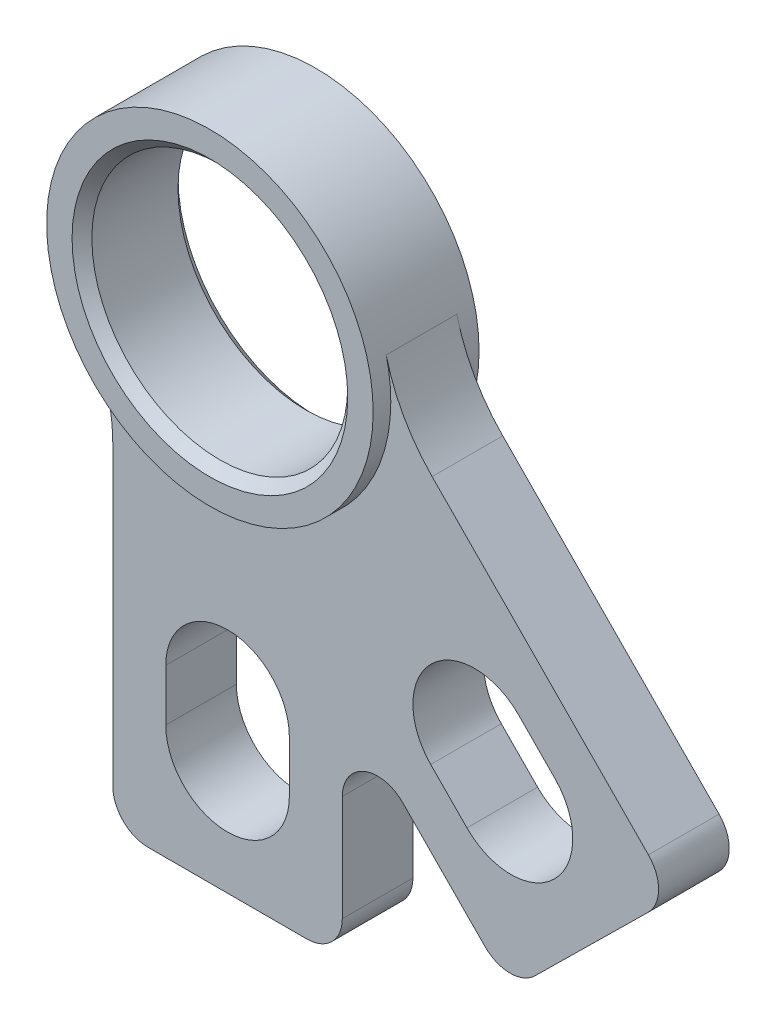
ISO-10303-21;
HEADER;
FILE_DESCRIPTION(('STEP AP214'),'2;1');
FILE_NAME('part.step','',(''),(''),'','','');
FILE_SCHEMA(('AUTOMOTIVE_DESIGN { 1 0 10303 214 1 1 1 1 }'));
ENDSEC;
DATA;
#1=APPLICATION_CONTEXT('core data for automotive mechanical design processes');
#2=APPLICATION_PROTOCOL_DEFINITION('international standard','automotive_design',2000,#1);
#3=PRODUCT_CONTEXT('',#1,'mechanical');
#4=PRODUCT('Part','Part','',(#3));
#5=PRODUCT_RELATED_PRODUCT_CATEGORY('part','',(#4));
#6=PRODUCT_DEFINITION_FORMATION('','',#4);
#7=PRODUCT_DEFINITION_CONTEXT('part definition',#1,'design');
#8=PRODUCT_DEFINITION('design','',#6,#7);
#9=PRODUCT_DEFINITION_SHAPE('','',#8);
#10=(LENGTH_UNIT() NAMED_UNIT(*) SI_UNIT(.MILLI.,.METRE.));
#11=(NAMED_UNIT(*) PLANE_ANGLE_UNIT() SI_UNIT($,.RADIAN.));
#12=(NAMED_UNIT(*) SI_UNIT($,.STERADIAN.) SOLID_ANGLE_UNIT());
#13=UNCERTAINTY_MEASURE_WITH_UNIT(LENGTH_MEASURE(1.E-05),#10,'distance_accuracy_value','');
#14=(GEOMETRIC_REPRESENTATION_CONTEXT(3) GLOBAL_UNCERTAINTY_ASSIGNED_CONTEXT((#13)) GLOBAL_UNIT_ASSIGNED_CONTEXT((#10,
#11,#12)) REPRESENTATION_CONTEXT('',''));
#15=CARTESIAN_POINT('',(0.,0.,0.));
#16=DIRECTION('',(0.,0.,1.));
#17=DIRECTION('',(1.,0.,0.));
#18=AXIS2_PLACEMENT_3D('',#15,#16,#17);
#19=CARTESIAN_POINT('',(0.,0.,4.7625));
#20=DIRECTION('',(0.,0.,-1.));
#21=DIRECTION('',(-1.,0.,0.));
#22=AXIS2_PLACEMENT_3D('',#19,#20,#21);
#23=CYLINDRICAL_SURFACE('',#22,11.5062);
#24=CARTESIAN_POINT('',(0.,0.,-3.87350000000004));
#25=DIRECTION('',(0.,0.,1.));
#26=DIRECTION('',(1.,0.,0.));
#27=AXIS2_PLACEMENT_3D('',#24,#25,#26);
#28=CIRCLE('',#27,11.5062);
#29=CARTESIAN_POINT('',(-11.5062,0.,-3.87350000000004));
#30=VERTEX_POINT('',#29);
#31=EDGE_CURVE('E50',#30,#30,#28,.F.);
#32=CARTESIAN_POINT('',(0.,0.,3.87349999999996));
#33=DIRECTION('',(0.,0.,1.));
#34=DIRECTION('',(1.,0.,0.));
#35=AXIS2_PLACEMENT_3D('',#32,#33,#34);
#36=CIRCLE('',#35,11.5062);
#37=CARTESIAN_POINT('',(-11.5062,0.,3.87349999999996));
#38=VERTEX_POINT('',#37);
#39=EDGE_CURVE('E481',#38,#38,#36,.T.);
#40=CARTESIAN_POINT('',(-11.5062,0.,-3.87350000000004));
#41=CARTESIAN_POINT('',(-11.5062,0.,-3.79280208333337));
#42=CARTESIAN_POINT('',(-11.5062,0.,-3.7121041666667));
#43=CARTESIAN_POINT('',(-11.5062,0.,-3.55070833333337));
#44=CARTESIAN_POINT('',(-11.5062,0.,-3.4700104166667));
#45=CARTESIAN_POINT('',(-11.5062,0.,-3.30861458333337));
#46=CARTESIAN_POINT('',(-11.5062,0.,-3.2279166666667));
#47=CARTESIAN_POINT('',(-11.5062,0.,-3.06652083333337));
#48=CARTESIAN_POINT('',(-11.5062,0.,-2.9858229166667));
#49=CARTESIAN_POINT('',(-11.5062,0.,-2.82442708333337));
#50=CARTESIAN_POINT('',(-11.5062,0.,-2.7437291666667));
#51=CARTESIAN_POINT('',(-11.5062,0.,-2.58233333333337));
#52=CARTESIAN_POINT('',(-11.5062,0.,-2.5016354166667));
#53=CARTESIAN_POINT('',(-11.5062,0.,-2.34023958333337));
#54=CARTESIAN_POINT('',(-11.5062,0.,-2.2595416666667));
#55=CARTESIAN_POINT('',(-11.5062,0.,-2.09814583333337));
#56=CARTESIAN_POINT('',(-11.5062,0.,-2.0174479166667));
#57=CARTESIAN_POINT('',(-11.5062,0.,-1.85605208333337));
#58=CARTESIAN_POINT('',(-11.5062,0.,-1.7753541666667));
#59=CARTESIAN_POINT('',(-11.5062,0.,-1.61395833333337));
#60=CARTESIAN_POINT('',(-11.5062,0.,-1.5332604166667));
#61=CARTESIAN_POINT('',(-11.5062,0.,-1.37186458333337));
#62=CARTESIAN_POINT('',(-11.5062,0.,-1.2911666666667));
#63=CARTESIAN_POINT('',(-11.5062,0.,-1.12977083333337));
#64=CARTESIAN_POINT('',(-11.5062,0.,-1.0490729166667));
#65=CARTESIAN_POINT('',(-11.5062,0.,-0.887677083333371));
#66=CARTESIAN_POINT('',(-11.5062,0.,-0.806979166666704));
#67=CARTESIAN_POINT('',(-11.5062,0.,-0.645583333333371));
#68=CARTESIAN_POINT('',(-11.5062,0.,-0.564885416666704));
#69=CARTESIAN_POINT('',(-11.5062,0.,-0.403489583333371));
#70=CARTESIAN_POINT('',(-11.5062,0.,-0.322791666666704));
#71=CARTESIAN_POINT('',(-11.5062,0.,-0.161395833333371));
#72=CARTESIAN_POINT('',(-11.5062,0.,-0.080697916666704));
#73=CARTESIAN_POINT('',(-11.5062,0.,0.0806979166666294));
#74=CARTESIAN_POINT('',(-11.5062,0.,0.161395833333296));
#75=CARTESIAN_POINT('',(-11.5062,0.,0.32279166666663));
#76=CARTESIAN_POINT('',(-11.5062,0.,0.403489583333296));
#77=CARTESIAN_POINT('',(-11.5062,0.,0.56488541666663));
#78=CARTESIAN_POINT('',(-11.5062,0.,0.645583333333296));
#79=CARTESIAN_POINT('',(-11.5062,0.,0.80697916666663));
#80=CARTESIAN_POINT('',(-11.5062,0.,0.887677083333296));
#81=CARTESIAN_POINT('',(-11.5062,0.,1.04907291666663));
#82=CARTESIAN_POINT('',(-11.5062,0.,1.1297708333333));
#83=CARTESIAN_POINT('',(-11.5062,0.,1.29116666666663));
#84=CARTESIAN_POINT('',(-11.5062,0.,1.3718645833333));
#85=CARTESIAN_POINT('',(-11.5062,0.,1.53326041666663));
#86=CARTESIAN_POINT('',(-11.5062,0.,1.6139583333333));
#87=CARTESIAN_POINT('',(-11.5062,0.,1.77535416666663));
#88=CARTESIAN_POINT('',(-11.5062,0.,1.8560520833333));
#89=CARTESIAN_POINT('',(-11.5062,0.,2.01744791666663));
#90=CARTESIAN_POINT('',(-11.5062,0.,2.0981458333333));
#91=CARTESIAN_POINT('',(-11.5062,0.,2.25954166666663));
#92=CARTESIAN_POINT('',(-11.5062,0.,2.3402395833333));
#93=CARTESIAN_POINT('',(-11.5062,0.,2.50163541666663));
#94=CARTESIAN_POINT('',(-11.5062,0.,2.5823333333333));
#95=CARTESIAN_POINT('',(-11.5062,0.,2.74372916666663));
#96=CARTESIAN_POINT('',(-11.5062,0.,2.8244270833333));
#97=CARTESIAN_POINT('',(-11.5062,0.,2.98582291666663));
#98=CARTESIAN_POINT('',(-11.5062,0.,3.0665208333333));
#99=CARTESIAN_POINT('',(-11.5062,0.,3.22791666666663));
#100=CARTESIAN_POINT('',(-11.5062,0.,3.3086145833333));
#101=CARTESIAN_POINT('',(-11.5062,0.,3.47001041666663));
#102=CARTESIAN_POINT('',(-11.5062,0.,3.5507083333333));
#103=CARTESIAN_POINT('',(-11.5062,0.,3.71210416666663));
#104=CARTESIAN_POINT('',(-11.5062,0.,3.7928020833333));
#105=CARTESIAN_POINT('',(-11.5062,0.,3.87349999999996));
#106=B_SPLINE_CURVE_WITH_KNOTS('',3,(#40,#41,#42,#43,#44,#45,#46,#47,#48,#49,#50,#51,#52,#53,
#54,#55,#56,#57,#58,#59,#60,#61,#62,#63,#64,#65,#66,#67,#68,#69,#70,#71,#72,#73,#74,#75,#76,#77,
#78,#79,#80,#81,#82,#83,#84,#85,#86,#87,#88,#89,#90,#91,#92,#93,#94,#95,#96,#97,#98,#99,#100,
#101,#102,#103,#104,#105),.UNSPECIFIED.,.F.,.F.,(4,2,2,2,2,2,2,2,2,2,2,2,2,2,2,2,2,2,2,2,2,2,2,
2,2,2,2,2,2,2,2,2,4),(0.,0.24209375,0.4841875,0.72628125,0.968375,1.21046875,1.4525625,
1.69465625,1.93675,2.17884375,2.4209375,2.66303125,2.905125,3.14721875,3.3893125,3.63140625,
3.8735,4.11559375,4.3576875,4.59978125,4.841875,5.08396875,5.3260625,5.56815625,5.81025,
6.05234375,6.2944375,6.53653125,6.778625,7.02071875,7.2628125,7.50490625,7.747),.UNSPECIFIED.);
#107=EDGE_CURVE('BSEAM41',#30,#38,#106,.T.);
#108=ORIENTED_EDGE('',*,*,#31,.T.);
#109=ORIENTED_EDGE('',*,*,#39,.T.);
#110=ORIENTED_EDGE('',*,*,#107,.T.);
#111=ORIENTED_EDGE('',*,*,#107,.F.);
#112=EDGE_LOOP('',(#108,#110,#109,#111));
#113=FACE_BOUND('',#112,.T.);
#114=ADVANCED_FACE('F41',(#113),#23,.F.);
#115=CARTESIAN_POINT('',(0.,0.,4.7625));
#116=DIRECTION('',(0.,0.,-1.));
#117=DIRECTION('',(-1.,0.,0.));
#118=AXIS2_PLACEMENT_3D('',#115,#116,#117);
#119=CYLINDRICAL_SURFACE('',#118,14.6812);
#120=DIRECTION('',(0.,0.,-1.));
#121=VECTOR('',#120,1.);
#122=CARTESIAN_POINT('',(-12.5851932668321,-7.55979787272683,3.175));
#123=LINE('',#122,#121);
#124=CARTESIAN_POINT('',(-12.5851932668321,-7.55979787272682,3.175));
#125=VERTEX_POINT('',#124);
#126=CARTESIAN_POINT('',(-12.5851932668321,-7.55979787272683,-3.175));
#127=VERTEX_POINT('',#126);
#128=EDGE_CURVE('E244',#125,#127,#123,.T.);
#129=ORIENTED_EDGE('',*,*,#128,.F.);
#130=CARTESIAN_POINT('',(0.,0.,3.175));
#131=DIRECTION('',(0.,0.,1.));
#132=DIRECTION('',(1.,0.,0.));
#133=AXIS2_PLACEMENT_3D('',#130,#131,#132);
#134=CIRCLE('',#133,14.6812);
#135=CARTESIAN_POINT('',(14.2696280521156,3.45186162733583,3.175));
#136=VERTEX_POINT('',#135);
#137=EDGE_CURVE('E261',#125,#136,#134,.T.);
#138=ORIENTED_EDGE('',*,*,#137,.T.);
#139=DIRECTION('',(0.,0.,-1.));
#140=VECTOR('',#139,1.);
#141=CARTESIAN_POINT('',(14.2696280521157,3.45186162733581,3.175));
#142=LINE('',#141,#140);
#143=CARTESIAN_POINT('',(14.2696280521157,3.45186162733581,-3.175));
#144=VERTEX_POINT('',#143);
#145=EDGE_CURVE('E317',#136,#144,#142,.T.);
#146=ORIENTED_EDGE('',*,*,#145,.T.);
#147=CARTESIAN_POINT('',(0.,0.,-3.175));
#148=DIRECTION('',(0.,0.,1.));
#149=DIRECTION('',(1.,0.,0.));
#150=AXIS2_PLACEMENT_3D('',#147,#148,#149);
#151=CIRCLE('',#150,14.6812);
#152=EDGE_CURVE('E318',#127,#144,#151,.T.);
#153=ORIENTED_EDGE('',*,*,#152,.F.);
#154=EDGE_LOOP('',(#129,#138,#146,#153));
#155=FACE_BOUND('',#154,.T.);
#156=CARTESIAN_POINT('',(0.,0.,4.7625));
#157=DIRECTION('',(0.,0.,1.));
#158=DIRECTION('',(1.,0.,0.));
#159=AXIS2_PLACEMENT_3D('',#156,#157,#158);
#160=CIRCLE('',#159,14.6812);
#161=CARTESIAN_POINT('',(14.6812,0.,4.7625));
#162=VERTEX_POINT('',#161);
#163=EDGE_CURVE('E408',#162,#162,#160,.T.);
#164=ORIENTED_EDGE('',*,*,#163,.F.);
#165=EDGE_LOOP('',(#164));
#166=FACE_BOUND('',#165,.T.);
#167=CARTESIAN_POINT('',(0.,0.,-4.7625));
#168=DIRECTION('',(0.,0.,1.));
#169=DIRECTION('',(1.,0.,0.));
#170=AXIS2_PLACEMENT_3D('',#167,#168,#169);
#171=CIRCLE('',#170,14.6812);
#172=CARTESIAN_POINT('',(14.6812,0.,-4.7625));
#173=VERTEX_POINT('',#172);
#174=EDGE_CURVE('E392',#173,#173,#171,.T.);
#175=ORIENTED_EDGE('',*,*,#174,.T.);
#176=EDGE_LOOP('',(#175));
#177=FACE_BOUND('',#176,.T.);
#178=ADVANCED_FACE('F503',(#155,#166,#177),#119,.T.);
#179=CARTESIAN_POINT('',(0.,0.,4.7625));
#180=DIRECTION('',(0.,0.,1.));
#181=DIRECTION('',(1.,0.,0.));
#182=AXIS2_PLACEMENT_3D('',#179,#180,#181);
#183=PLANE('',#182);
#184=CARTESIAN_POINT('',(0.,0.,4.7625));
#185=DIRECTION('',(0.,0.,1.));
#186=DIRECTION('',(1.,0.,0.));
#187=AXIS2_PLACEMENT_3D('',#184,#185,#186);
#188=CIRCLE('',#187,12.3952);
#189=CARTESIAN_POINT('',(12.3952,0.,4.7625));
#190=VERTEX_POINT('',#189);
#191=EDGE_CURVE('E11',#190,#190,#188,.F.);
#192=ORIENTED_EDGE('',*,*,#191,.T.);
#193=EDGE_LOOP('',(#192));
#194=FACE_BOUND('',#193,.T.);
#195=ORIENTED_EDGE('',*,*,#163,.T.);
#196=EDGE_LOOP('',(#195));
#197=FACE_BOUND('',#196,.T.);
#198=ADVANCED_FACE('F499',(#194,#197),#183,.T.);
#199=CARTESIAN_POINT('',(0.,0.,-4.7625));
#200=DIRECTION('',(0.,0.,1.));
#201=DIRECTION('',(1.,0.,0.));
#202=AXIS2_PLACEMENT_3D('',#199,#200,#201);
#203=PLANE('',#202);
#204=CARTESIAN_POINT('',(0.,0.,-4.7625));
#205=DIRECTION('',(0.,0.,1.));
#206=DIRECTION('',(1.,0.,0.));
#207=AXIS2_PLACEMENT_3D('',#204,#205,#206);
#208=CIRCLE('',#207,12.3952);
#209=CARTESIAN_POINT('',(12.3952,0.,-4.7625));
#210=VERTEX_POINT('',#209);
#211=EDGE_CURVE('E477',#210,#210,#208,.T.);
#212=ORIENTED_EDGE('',*,*,#211,.T.);
#213=EDGE_LOOP('',(#212));
#214=FACE_BOUND('',#213,.T.);
#215=ORIENTED_EDGE('',*,*,#174,.F.);
#216=EDGE_LOOP('',(#215));
#217=FACE_BOUND('',#216,.T.);
#218=ADVANCED_FACE('F495',(#214,#217),#203,.F.);
#219=CARTESIAN_POINT('',(0.,-30.6387499999984,3.175));
#220=DIRECTION('',(0.,0.,-1.));
#221=DIRECTION('',(-1.,0.,0.));
#222=AXIS2_PLACEMENT_3D('',#219,#220,#221);
#223=CYLINDRICAL_SURFACE('',#222,5.55624999999839);
#224=CARTESIAN_POINT('',(0.,-30.6387499999984,-3.175));
#225=DIRECTION('',(0.,0.,1.));
#226=DIRECTION('',(1.,0.,0.));
#227=AXIS2_PLACEMENT_3D('',#224,#225,#226);
#228=CIRCLE('',#227,5.55624999999839);
#229=CARTESIAN_POINT('',(5.55624999999834,-30.6387499999984,-3.175));
#230=VERTEX_POINT('',#229);
#231=CARTESIAN_POINT('',(-5.55624999999845,-30.6387499999984,-3.175));
#232=VERTEX_POINT('',#231);
#233=EDGE_CURVE('E364',#230,#232,#228,.T.);
#234=ORIENTED_EDGE('',*,*,#233,.F.);
#235=DIRECTION('',(0.,0.,-1.));
#236=VECTOR('',#235,1.);
#237=CARTESIAN_POINT('',(5.55624999999834,-30.6387499999984,3.175));
#238=LINE('',#237,#236);
#239=CARTESIAN_POINT('',(5.55624999999834,-30.6387499999984,3.175));
#240=VERTEX_POINT('',#239);
#241=EDGE_CURVE('E389',#240,#230,#238,.T.);
#242=ORIENTED_EDGE('',*,*,#241,.F.);
#243=CARTESIAN_POINT('',(0.,-30.6387499999984,3.175));
#244=DIRECTION('',(0.,0.,1.));
#245=DIRECTION('',(1.,0.,0.));
#246=AXIS2_PLACEMENT_3D('',#243,#244,#245);
#247=CIRCLE('',#246,5.55624999999839);
#248=CARTESIAN_POINT('',(-5.55624999999845,-30.6387499999984,3.175));
#249=VERTEX_POINT('',#248);
#250=EDGE_CURVE('E302',#240,#249,#247,.T.);
#251=ORIENTED_EDGE('',*,*,#250,.T.);
#252=DIRECTION('',(0.,0.,-1.));
#253=VECTOR('',#252,1.);
#254=CARTESIAN_POINT('',(-5.55624999999845,-30.6387499999984,3.175));
#255=LINE('',#254,#253);
#256=EDGE_CURVE('E379',#249,#232,#255,.T.);
#257=ORIENTED_EDGE('',*,*,#256,.T.);
#258=EDGE_LOOP('',(#234,#242,#251,#257));
#259=FACE_BOUND('',#258,.T.);
#260=ADVANCED_FACE('F498',(#259),#223,.F.);
#261=CARTESIAN_POINT('',(5.55624999999835,0.,3.175));
#262=DIRECTION('',(-1.,0.,0.));
#263=DIRECTION('',(0.,-1.,0.));
#264=AXIS2_PLACEMENT_3D('',#261,#262,#263);
#265=PLANE('',#264);
#266=DIRECTION('',(0.,1.,0.));
#267=VECTOR('',#266,1.);
#268=CARTESIAN_POINT('',(5.55624999999835,0.,-3.175));
#269=LINE('',#268,#267);
#270=CARTESIAN_POINT('',(5.55624999999834,-35.286077056792,-3.175));
#271=VERTEX_POINT('',#270);
#272=EDGE_CURVE('E368',#271,#230,#269,.T.);
#273=ORIENTED_EDGE('',*,*,#272,.F.);
#274=DIRECTION('',(0.,0.,-1.));
#275=VECTOR('',#274,1.);
#276=CARTESIAN_POINT('',(5.55624999999834,-35.286077056792,3.175));
#277=LINE('',#276,#275);
#278=CARTESIAN_POINT('',(5.55624999999834,-35.286077056792,3.175));
#279=VERTEX_POINT('',#278);
#280=EDGE_CURVE('E386',#279,#271,#277,.T.);
#281=ORIENTED_EDGE('',*,*,#280,.F.);
#282=DIRECTION('',(0.,1.,0.));
#283=VECTOR('',#282,1.);
#284=CARTESIAN_POINT('',(5.55624999999835,0.,3.175));
#285=LINE('',#284,#283);
#286=EDGE_CURVE('E306',#279,#240,#285,.T.);
#287=ORIENTED_EDGE('',*,*,#286,.T.);
#288=ORIENTED_EDGE('',*,*,#241,.T.);
#289=EDGE_LOOP('',(#273,#281,#287,#288));
#290=FACE_BOUND('',#289,.T.);
#291=ADVANCED_FACE('F641',(#290),#265,.T.);
#292=CARTESIAN_POINT('',(0.,-35.286077056792,3.175));
#293=DIRECTION('',(0.,0.,-1.));
#294=DIRECTION('',(-1.,0.,0.));
#295=AXIS2_PLACEMENT_3D('',#292,#293,#294);
#296=CYLINDRICAL_SURFACE('',#295,5.55624999999839);
#297=CARTESIAN_POINT('',(0.,-35.286077056792,-3.175));
#298=DIRECTION('',(0.,0.,1.));
#299=DIRECTION('',(1.,0.,0.));
#300=AXIS2_PLACEMENT_3D('',#297,#298,#299);
#301=CIRCLE('',#300,5.55624999999839);
#302=CARTESIAN_POINT('',(-5.55624999999845,-35.286077056792,-3.175));
#303=VERTEX_POINT('',#302);
#304=EDGE_CURVE('E372',#303,#271,#301,.T.);
#305=ORIENTED_EDGE('',*,*,#304,.F.);
#306=DIRECTION('',(0.,0.,-1.));
#307=VECTOR('',#306,1.);
#308=CARTESIAN_POINT('',(-5.55624999999845,-35.286077056792,3.175));
#309=LINE('',#308,#307);
#310=CARTESIAN_POINT('',(-5.55624999999845,-35.286077056792,3.175));
#311=VERTEX_POINT('',#310);
#312=EDGE_CURVE('E382',#311,#303,#309,.T.);
#313=ORIENTED_EDGE('',*,*,#312,.F.);
#314=CARTESIAN_POINT('',(0.,-35.286077056792,3.175));
#315=DIRECTION('',(0.,0.,1.));
#316=DIRECTION('',(1.,0.,0.));
#317=AXIS2_PLACEMENT_3D('',#314,#315,#316);
#318=CIRCLE('',#317,5.55624999999839);
#319=EDGE_CURVE('E310',#311,#279,#318,.T.);
#320=ORIENTED_EDGE('',*,*,#319,.T.);
#321=ORIENTED_EDGE('',*,*,#280,.T.);
#322=EDGE_LOOP('',(#305,#313,#320,#321));
#323=FACE_BOUND('',#322,.T.);
#324=ADVANCED_FACE('F608',(#323),#296,.F.);
#325=CARTESIAN_POINT('',(22.2231664146945,-22.5422730013455,3.175));
#326=DIRECTION('',(0.,0.,-1.));
#327=DIRECTION('',(-1.,0.,0.));
#328=AXIS2_PLACEMENT_3D('',#325,#326,#327);
#329=CYLINDRICAL_SURFACE('',#328,5.55624999999846);
#330=CARTESIAN_POINT('',(22.2231664146945,-22.5422730013455,-3.175));
#331=DIRECTION('',(0.,0.,1.));
#332=DIRECTION('',(1.,0.,0.));
#333=AXIS2_PLACEMENT_3D('',#330,#331,#332);
#334=CIRCLE('',#333,5.55624999999846);
#335=CARTESIAN_POINT('',(26.1799344941676,-18.6415166095996,-3.175));
#336=VERTEX_POINT('',#335);
#337=CARTESIAN_POINT('',(18.2663983352216,-26.4430293930914,-3.175));
#338=VERTEX_POINT('',#337);
#339=EDGE_CURVE('E348',#336,#338,#334,.T.);
#340=ORIENTED_EDGE('',*,*,#339,.F.);
#341=DIRECTION('',(0.,0.,-1.));
#342=VECTOR('',#341,1.);
#343=CARTESIAN_POINT('',(26.1799344941676,-18.6415166095996,3.175));
#344=LINE('',#343,#342);
#345=CARTESIAN_POINT('',(26.1799344941676,-18.6415166095996,3.175));
#346=VERTEX_POINT('',#345);
#347=EDGE_CURVE('E383',#346,#336,#344,.T.);
#348=ORIENTED_EDGE('',*,*,#347,.F.);
#349=CARTESIAN_POINT('',(22.2231664146945,-22.5422730013455,3.175));
#350=DIRECTION('',(0.,0.,1.));
#351=DIRECTION('',(1.,0.,0.));
#352=AXIS2_PLACEMENT_3D('',#349,#350,#351);
#353=CIRCLE('',#352,5.55624999999846);
#354=CARTESIAN_POINT('',(18.2663983352216,-26.4430293930914,3.175));
#355=VERTEX_POINT('',#354);
#356=EDGE_CURVE('E287',#346,#355,#353,.T.);
#357=ORIENTED_EDGE('',*,*,#356,.T.);
#358=DIRECTION('',(0.,0.,-1.));
#359=VECTOR('',#358,1.);
#360=CARTESIAN_POINT('',(18.2663983352216,-26.4430293930914,3.175));
#361=LINE('',#360,#359);
#362=EDGE_CURVE('E393',#355,#338,#361,.T.);
#363=ORIENTED_EDGE('',*,*,#362,.T.);
#364=EDGE_LOOP('',(#340,#348,#357,#363));
#365=FACE_BOUND('',#364,.T.);
#366=ADVANCED_FACE('F600',(#365),#329,.F.);
#367=CARTESIAN_POINT('',(3.95676807947296,3.90075639174589,3.175));
#368=DIRECTION('',(-0.712129238150565,-0.70204839446515,0.));
#369=DIRECTION('',(0.70204839446515,-0.712129238150565,0.));
#370=AXIS2_PLACEMENT_3D('',#367,#368,#369);
#371=PLANE('',#370);
#372=DIRECTION('',(-0.70204839446515,0.712129238150565,0.));
#373=VECTOR('',#372,1.);
#374=CARTESIAN_POINT('',(3.95676807947296,3.90075639174589,-3.175));
#375=LINE('',#374,#373);
#376=CARTESIAN_POINT('',(29.4425829929439,-21.9510140859905,-3.175));
#377=VERTEX_POINT('',#376);
#378=EDGE_CURVE('E352',#377,#336,#375,.T.);
#379=ORIENTED_EDGE('',*,*,#378,.F.);
#380=DIRECTION('',(0.,0.,-1.));
#381=VECTOR('',#380,1.);
#382=CARTESIAN_POINT('',(29.4425829929439,-21.9510140859905,3.175));
#383=LINE('',#382,#381);
#384=CARTESIAN_POINT('',(29.4425829929439,-21.9510140859905,3.175));
#385=VERTEX_POINT('',#384);
#386=EDGE_CURVE('E399',#385,#377,#383,.T.);
#387=ORIENTED_EDGE('',*,*,#386,.F.);
#388=DIRECTION('',(-0.70204839446515,0.712129238150565,0.));
#389=VECTOR('',#388,1.);
#390=CARTESIAN_POINT('',(3.95676807947296,3.90075639174589,3.175));
#391=LINE('',#390,#389);
#392=EDGE_CURVE('E291',#385,#346,#391,.T.);
#393=ORIENTED_EDGE('',*,*,#392,.T.);
#394=ORIENTED_EDGE('',*,*,#347,.T.);
#395=EDGE_LOOP('',(#379,#387,#393,#394));
#396=FACE_BOUND('',#395,.T.);
#397=ADVANCED_FACE('F594',(#396),#371,.T.);
#398=CARTESIAN_POINT('',(25.4858149134709,-25.8517704777364,3.175));
#399=DIRECTION('',(0.,0.,-1.));
#400=DIRECTION('',(-1.,0.,0.));
#401=AXIS2_PLACEMENT_3D('',#398,#399,#400);
#402=CYLINDRICAL_SURFACE('',#401,5.55624999999846);
#403=CARTESIAN_POINT('',(25.4858149134709,-25.8517704777364,-3.175));
#404=DIRECTION('',(0.,0.,1.));
#405=DIRECTION('',(1.,0.,0.));
#406=AXIS2_PLACEMENT_3D('',#403,#404,#405);
#407=CIRCLE('',#406,5.55624999999846);
#408=CARTESIAN_POINT('',(21.529046833998,-29.7525268694823,-3.175));
#409=VERTEX_POINT('',#408);
#410=EDGE_CURVE('E356',#409,#377,#407,.T.);
#411=ORIENTED_EDGE('',*,*,#410,.F.);
#412=DIRECTION('',(0.,0.,-1.));
#413=VECTOR('',#412,1.);
#414=CARTESIAN_POINT('',(21.529046833998,-29.7525268694823,3.175));
#415=LINE('',#414,#413);
#416=CARTESIAN_POINT('',(21.529046833998,-29.7525268694823,3.175));
#417=VERTEX_POINT('',#416);
#418=EDGE_CURVE('E396',#417,#409,#415,.T.);
#419=ORIENTED_EDGE('',*,*,#418,.F.);
#420=CARTESIAN_POINT('',(25.4858149134709,-25.8517704777364,3.175));
#421=DIRECTION('',(0.,0.,1.));
#422=DIRECTION('',(1.,0.,0.));
#423=AXIS2_PLACEMENT_3D('',#420,#421,#422);
#424=CIRCLE('',#423,5.55624999999846);
#425=EDGE_CURVE('E295',#417,#385,#424,.T.);
#426=ORIENTED_EDGE('',*,*,#425,.T.);
#427=ORIENTED_EDGE('',*,*,#386,.T.);
#428=EDGE_LOOP('',(#411,#419,#426,#427));
#429=FACE_BOUND('',#428,.T.);
#430=ADVANCED_FACE('F590',(#429),#402,.F.);
#431=CARTESIAN_POINT('',(-26.1937499999968,-15.7343197939272,3.175));
#432=DIRECTION('',(0.,0.,-1.));
#433=DIRECTION('',(-1.,0.,0.));
#434=AXIS2_PLACEMENT_3D('',#431,#432,#433);
#435=CYLINDRICAL_SURFACE('',#434,15.8749999999984);
#436=CARTESIAN_POINT('',(-26.1937499999968,-15.7343197939272,-3.175));
#437=DIRECTION('',(0.,0.,1.));
#438=DIRECTION('',(1.,0.,0.));
#439=AXIS2_PLACEMENT_3D('',#436,#437,#438);
#440=CIRCLE('',#439,15.8749999999984);
#441=CARTESIAN_POINT('',(-10.3187499999984,-15.7343197939272,-3.175));
#442=VERTEX_POINT('',#441);
#443=EDGE_CURVE('E239',#442,#127,#440,.T.);
#444=ORIENTED_EDGE('',*,*,#443,.F.);
#445=DIRECTION('',(0.,0.,-1.));
#446=VECTOR('',#445,1.);
#447=CARTESIAN_POINT('',(-10.3187499999984,-15.7343197939272,3.175));
#448=LINE('',#447,#446);
#449=CARTESIAN_POINT('',(-10.3187499999984,-15.7343197939272,3.175));
#450=VERTEX_POINT('',#449);
#451=EDGE_CURVE('E232',#450,#442,#448,.T.);
#452=ORIENTED_EDGE('',*,*,#451,.F.);
#453=CARTESIAN_POINT('',(-26.1937499999968,-15.7343197939272,3.175));
#454=DIRECTION('',(0.,0.,1.));
#455=DIRECTION('',(1.,0.,0.));
#456=AXIS2_PLACEMENT_3D('',#453,#454,#455);
#457=CIRCLE('',#456,15.8749999999984);
#458=EDGE_CURVE('E237',#450,#125,#457,.T.);
#459=ORIENTED_EDGE('',*,*,#458,.T.);
#460=ORIENTED_EDGE('',*,*,#128,.T.);
#461=EDGE_LOOP('',(#444,#452,#459,#460));
#462=FACE_BOUND('',#461,.T.);
#463=ADVANCED_FACE('F234',(#462),#435,.F.);
#464=CARTESIAN_POINT('',(-10.3187499999984,0.,3.175));
#465=DIRECTION('',(1.,0.,0.));
#466=DIRECTION('',(0.,1.,0.));
#467=AXIS2_PLACEMENT_3D('',#464,#465,#466);
#468=PLANE('',#467);
#469=DIRECTION('',(0.,-1.,0.));
#470=VECTOR('',#469,1.);
#471=CARTESIAN_POINT('',(-10.3187499999984,0.,-3.175));
#472=LINE('',#471,#470);
#473=CARTESIAN_POINT('',(-10.3187499999985,-42.4298270567904,-3.175));
#474=VERTEX_POINT('',#473);
#475=EDGE_CURVE('E324',#442,#474,#472,.T.);
#476=ORIENTED_EDGE('',*,*,#475,.T.);
#477=DIRECTION('',(0.,0.,-1.));
#478=VECTOR('',#477,1.);
#479=CARTESIAN_POINT('',(-10.3187499999985,-42.4298270567904,3.175));
#480=LINE('',#479,#478);
#481=CARTESIAN_POINT('',(-10.3187499999985,-42.4298270567904,3.175));
#482=VERTEX_POINT('',#481);
#483=EDGE_CURVE('E251',#474,#482,#480,.F.);
#484=ORIENTED_EDGE('',*,*,#483,.T.);
#485=DIRECTION('',(0.,-1.,0.));
#486=VECTOR('',#485,1.);
#487=CARTESIAN_POINT('',(-10.3187499999984,0.,3.175));
#488=LINE('',#487,#486);
#489=EDGE_CURVE('E248',#450,#482,#488,.T.);
#490=ORIENTED_EDGE('',*,*,#489,.F.);
#491=ORIENTED_EDGE('',*,*,#451,.T.);
#492=EDGE_LOOP('',(#476,#484,#490,#491));
#493=FACE_BOUND('',#492,.T.);
#494=ADVANCED_FACE('F249',(#493),#468,.F.);
#495=CARTESIAN_POINT('',(0.,-45.6048270567904,3.175));
#496=DIRECTION('',(0.,1.,0.));
#497=DIRECTION('',(-1.,0.,0.));
#498=AXIS2_PLACEMENT_3D('',#495,#496,#497);
#499=PLANE('',#498);
#500=DIRECTION('',(1.,0.,0.));
#501=VECTOR('',#500,1.);
#502=CARTESIAN_POINT('',(0.,-45.6048270567904,-3.175));
#503=LINE('',#502,#501);
#504=CARTESIAN_POINT('',(-7.14374999999846,-45.6048270567903,-3.175));
#505=VERTEX_POINT('',#504);
#506=CARTESIAN_POINT('',(7.14374999999836,-45.6048270567904,-3.175));
#507=VERTEX_POINT('',#506);
#508=EDGE_CURVE('E327',#505,#507,#503,.T.);
#509=ORIENTED_EDGE('',*,*,#508,.T.);
#510=DIRECTION('',(0.,0.,-1.));
#511=VECTOR('',#510,1.);
#512=CARTESIAN_POINT('',(7.14374999999836,-45.6048270567904,3.175));
#513=LINE('',#512,#511);
#514=CARTESIAN_POINT('',(7.14374999999836,-45.6048270567904,3.175));
#515=VERTEX_POINT('',#514);
#516=EDGE_CURVE('E71',#507,#515,#513,.F.);
#517=ORIENTED_EDGE('',*,*,#516,.T.);
#518=DIRECTION('',(1.,0.,0.));
#519=VECTOR('',#518,1.);
#520=CARTESIAN_POINT('',(0.,-45.6048270567904,3.175));
#521=LINE('',#520,#519);
#522=CARTESIAN_POINT('',(-7.14374999999846,-45.6048270567903,3.175));
#523=VERTEX_POINT('',#522);
#524=EDGE_CURVE('E254',#523,#515,#521,.T.);
#525=ORIENTED_EDGE('',*,*,#524,.F.);
#526=DIRECTION('',(0.,0.,-1.));
#527=VECTOR('',#526,1.);
#528=CARTESIAN_POINT('',(-7.14374999999846,-45.6048270567903,3.175));
#529=LINE('',#528,#527);
#530=EDGE_CURVE('E459',#523,#505,#529,.T.);
#531=ORIENTED_EDGE('',*,*,#530,.T.);
#532=EDGE_LOOP('',(#509,#517,#525,#531));
#533=FACE_BOUND('',#532,.T.);
#534=ADVANCED_FACE('F554',(#533),#499,.F.);
#535=CARTESIAN_POINT('',(10.318749999999,-1.47125848119648E-13,3.175));
#536=DIRECTION('',(-1.,0.,0.));
#537=DIRECTION('',(0.,-1.,0.));
#538=AXIS2_PLACEMENT_3D('',#535,#536,#537);
#539=PLANE('',#538);
#540=DIRECTION('',(0.,1.,0.));
#541=VECTOR('',#540,1.);
#542=CARTESIAN_POINT('',(10.318749999999,-1.47125848119648E-13,-3.175));
#543=LINE('',#542,#541);
#544=CARTESIAN_POINT('',(10.3187499999984,-42.4298270567904,-3.175));
#545=VERTEX_POINT('',#544);
#546=CARTESIAN_POINT('',(10.3187499999985,-32.9080503415899,-3.175));
#547=VERTEX_POINT('',#546);
#548=EDGE_CURVE('E330',#545,#547,#543,.T.);
#549=ORIENTED_EDGE('',*,*,#548,.T.);
#550=DIRECTION('',(0.,0.,-1.));
#551=VECTOR('',#550,1.);
#552=CARTESIAN_POINT('',(10.3187499999985,-32.9080503415899,3.175));
#553=LINE('',#552,#551);
#554=CARTESIAN_POINT('',(10.3187499999985,-32.9080503415899,3.175));
#555=VERTEX_POINT('',#554);
#556=EDGE_CURVE('E426',#547,#555,#553,.F.);
#557=ORIENTED_EDGE('',*,*,#556,.T.);
#558=DIRECTION('',(0.,1.,0.));
#559=VECTOR('',#558,1.);
#560=CARTESIAN_POINT('',(10.318749999999,-1.47125848119648E-13,3.175));
#561=LINE('',#560,#559);
#562=CARTESIAN_POINT('',(10.3187499999984,-42.4298270567904,3.175));
#563=VERTEX_POINT('',#562);
#564=EDGE_CURVE('E271',#563,#555,#561,.T.);
#565=ORIENTED_EDGE('',*,*,#564,.F.);
#566=DIRECTION('',(0.,0.,-1.));
#567=VECTOR('',#566,1.);
#568=CARTESIAN_POINT('',(10.3187499999984,-42.4298270567904,3.175));
#569=LINE('',#568,#567);
#570=EDGE_CURVE('E422',#563,#545,#569,.T.);
#571=ORIENTED_EDGE('',*,*,#570,.T.);
#572=EDGE_LOOP('',(#549,#557,#565,#571));
#573=FACE_BOUND('',#572,.T.);
#574=ADVANCED_FACE('F559',(#573),#539,.F.);
#575=CARTESIAN_POINT('',(-7.34828357616504,-7.24426187038617,3.175));
#576=DIRECTION('',(-0.712129238150566,-0.70204839446515,0.));
#577=DIRECTION('',(0.70204839446515,-0.712129238150566,0.));
#578=AXIS2_PLACEMENT_3D('',#575,#576,#577);
#579=PLANE('',#578);
#580=DIRECTION('',(-0.70204839446515,0.712129238150566,0.));
#581=VECTOR('',#580,1.);
#582=CARTESIAN_POINT('',(-7.34828357616504,-7.24426187038617,3.175));
#583=LINE('',#582,#581);
#584=CARTESIAN_POINT('',(23.1527895552652,-38.1833055931596,3.175));
#585=VERTEX_POINT('',#584);
#586=CARTESIAN_POINT('',(15.7547603311266,-30.6790466891632,3.175));
#587=VERTEX_POINT('',#586);
#588=EDGE_CURVE('E275',#585,#587,#583,.T.);
#589=ORIENTED_EDGE('',*,*,#588,.T.);
#590=DIRECTION('',(0.,0.,-1.));
#591=VECTOR('',#590,1.);
#592=CARTESIAN_POINT('',(15.7547603311266,-30.6790466891632,3.175));
#593=LINE('',#592,#591);
#594=CARTESIAN_POINT('',(15.7547603311266,-30.6790466891632,-3.175));
#595=VERTEX_POINT('',#594);
#596=EDGE_CURVE('E418',#587,#595,#593,.T.);
#597=ORIENTED_EDGE('',*,*,#596,.T.);
#598=DIRECTION('',(-0.70204839446515,0.712129238150566,0.));
#599=VECTOR('',#598,1.);
#600=CARTESIAN_POINT('',(-7.34828357616504,-7.24426187038617,-3.175));
#601=LINE('',#600,#599);
#602=CARTESIAN_POINT('',(23.1527895552652,-38.1833055931596,-3.175));
#603=VERTEX_POINT('',#602);
#604=EDGE_CURVE('E334',#603,#595,#601,.T.);
#605=ORIENTED_EDGE('',*,*,#604,.F.);
#606=DIRECTION('',(0.,0.,-1.));
#607=VECTOR('',#606,1.);
#608=CARTESIAN_POINT('',(23.1527895552652,-38.1833055931596,3.175));
#609=LINE('',#608,#607);
#610=EDGE_CURVE('E412',#603,#585,#609,.F.);
#611=ORIENTED_EDGE('',*,*,#610,.T.);
#612=EDGE_LOOP('',(#589,#597,#605,#611));
#613=FACE_BOUND('',#612,.T.);
#614=ADVANCED_FACE('F565',(#613),#579,.T.);
#615=CARTESIAN_POINT('',(32.7300767838571,-33.2000540539014,3.175));
#616=DIRECTION('',(-0.70204839446515,0.712129238150566,0.));
#617=DIRECTION('',(-0.712129238150566,-0.70204839446515,0.));
#618=AXIS2_PLACEMENT_3D('',#615,#616,#617);
#619=PLANE('',#618);
#620=DIRECTION('',(0.712129238150566,0.70204839446515,0.));
#621=VECTOR('',#620,1.);
#622=CARTESIAN_POINT('',(32.7300767838571,-33.2000540539014,3.175));
#623=LINE('',#622,#621);
#624=CARTESIAN_POINT('',(27.6428035388201,-38.2153122718608,3.175));
#625=VERTEX_POINT('',#624);
#626=CARTESIAN_POINT('',(37.817350028894,-28.1847958359422,3.175));
#627=VERTEX_POINT('',#626);
#628=EDGE_CURVE('E279',#625,#627,#623,.T.);
#629=ORIENTED_EDGE('',*,*,#628,.F.);
#630=DIRECTION('',(0.,0.,-1.));
#631=VECTOR('',#630,1.);
#632=CARTESIAN_POINT('',(27.6428035388201,-38.2153122718608,-3.175));
#633=LINE('',#632,#631);
#634=CARTESIAN_POINT('',(27.6428035388201,-38.2153122718608,-3.175));
#635=VERTEX_POINT('',#634);
#636=EDGE_CURVE('E432',#625,#635,#633,.T.);
#637=ORIENTED_EDGE('',*,*,#636,.T.);
#638=DIRECTION('',(0.712129238150566,0.70204839446515,0.));
#639=VECTOR('',#638,1.);
#640=CARTESIAN_POINT('',(32.7300767838571,-33.2000540539014,-3.175));
#641=LINE('',#640,#639);
#642=CARTESIAN_POINT('',(37.817350028894,-28.1847958359422,-3.175));
#643=VERTEX_POINT('',#642);
#644=EDGE_CURVE('E338',#635,#643,#641,.T.);
#645=ORIENTED_EDGE('',*,*,#644,.T.);
#646=DIRECTION('',(0.,0.,-1.));
#647=VECTOR('',#646,1.);
#648=CARTESIAN_POINT('',(37.817350028894,-28.1847958359422,3.175));
#649=LINE('',#648,#647);
#650=EDGE_CURVE('E429',#643,#627,#649,.F.);
#651=ORIENTED_EDGE('',*,*,#650,.T.);
#652=EDGE_LOOP('',(#629,#637,#645,#651));
#653=FACE_BOUND('',#652,.T.);
#654=ADVANCED_FACE('F571',(#653),#619,.F.);
#655=CARTESIAN_POINT('',(7.34828357616504,7.24426187038614,3.175));
#656=DIRECTION('',(-0.712129238150567,-0.702048394465148,0.));
#657=DIRECTION('',(0.702048394465149,-0.712129238150567,0.));
#658=AXIS2_PLACEMENT_3D('',#655,#656,#657);
#659=PLANE('',#658);
#660=DIRECTION('',(-0.702048394465149,0.712129238150567,0.));
#661=VECTOR('',#660,1.);
#662=CARTESIAN_POINT('',(7.34828357616504,7.24426187038614,3.175));
#663=LINE('',#662,#661);
#664=CARTESIAN_POINT('',(37.8493567075952,-23.6947818523873,3.175));
#665=VERTEX_POINT('',#664);
#666=CARTESIAN_POINT('',(18.3945375254928,-3.96060729728063,3.175));
#667=VERTEX_POINT('',#666);
#668=EDGE_CURVE('E282',#665,#667,#663,.T.);
#669=ORIENTED_EDGE('',*,*,#668,.F.);
#670=DIRECTION('',(0.,0.,-1.));
#671=VECTOR('',#670,1.);
#672=CARTESIAN_POINT('',(37.8493567075952,-23.6947818523873,3.175));
#673=LINE('',#672,#671);
#674=CARTESIAN_POINT('',(37.8493567075952,-23.6947818523873,-3.175));
#675=VERTEX_POINT('',#674);
#676=EDGE_CURVE('E467',#665,#675,#673,.T.);
#677=ORIENTED_EDGE('',*,*,#676,.T.);
#678=DIRECTION('',(-0.702048394465149,0.712129238150567,0.));
#679=VECTOR('',#678,1.);
#680=CARTESIAN_POINT('',(7.34828357616504,7.24426187038614,-3.175));
#681=LINE('',#680,#679);
#682=CARTESIAN_POINT('',(18.3945375254928,-3.96060729728063,-3.175));
#683=VERTEX_POINT('',#682);
#684=EDGE_CURVE('E342',#675,#683,#681,.T.);
#685=ORIENTED_EDGE('',*,*,#684,.T.);
#686=DIRECTION('',(0.,0.,-1.));
#687=VECTOR('',#686,1.);
#688=CARTESIAN_POINT('',(18.3945375254928,-3.96060729728063,3.175));
#689=LINE('',#688,#687);
#690=EDGE_CURVE('E245',#667,#683,#689,.T.);
#691=ORIENTED_EDGE('',*,*,#690,.F.);
#692=EDGE_LOOP('',(#669,#677,#685,#691));
#693=FACE_BOUND('',#692,.T.);
#694=ADVANCED_FACE('F541',(#693),#659,.F.);
#695=CARTESIAN_POINT('',(-3.956768079473,-3.90075639174593,3.175));
#696=DIRECTION('',(-0.712129238150565,-0.70204839446515,0.));
#697=DIRECTION('',(0.70204839446515,-0.712129238150565,0.));
#698=AXIS2_PLACEMENT_3D('',#695,#696,#697);
#699=PLANE('',#698);
#700=DIRECTION('',(-0.70204839446515,0.712129238150565,0.));
#701=VECTOR('',#700,1.);
#702=CARTESIAN_POINT('',(-3.956768079473,-3.90075639174593,-3.175));
#703=LINE('',#702,#701);
#704=EDGE_CURVE('E360',#409,#338,#703,.T.);
#705=ORIENTED_EDGE('',*,*,#704,.T.);
#706=ORIENTED_EDGE('',*,*,#362,.F.);
#707=DIRECTION('',(-0.70204839446515,0.712129238150565,0.));
#708=VECTOR('',#707,1.);
#709=CARTESIAN_POINT('',(-3.956768079473,-3.90075639174593,3.175));
#710=LINE('',#709,#708);
#711=EDGE_CURVE('E299',#417,#355,#710,.T.);
#712=ORIENTED_EDGE('',*,*,#711,.F.);
#713=ORIENTED_EDGE('',*,*,#418,.T.);
#714=EDGE_LOOP('',(#705,#706,#712,#713));
#715=FACE_BOUND('',#714,.T.);
#716=ADVANCED_FACE('F578',(#715),#699,.F.);
#717=CARTESIAN_POINT('',(29.6995891811319,7.18441096485258,3.175));
#718=DIRECTION('',(0.,0.,-1.));
#719=DIRECTION('',(-1.,0.,0.));
#720=AXIS2_PLACEMENT_3D('',#717,#718,#719);
#721=CYLINDRICAL_SURFACE('',#720,15.8749999999984);
#722=CARTESIAN_POINT('',(29.6995891811319,7.18441096485258,-3.175));
#723=DIRECTION('',(0.,0.,1.));
#724=DIRECTION('',(1.,0.,0.));
#725=AXIS2_PLACEMENT_3D('',#722,#723,#724);
#726=CIRCLE('',#725,15.8749999999984);
#727=EDGE_CURVE('E345',#683,#144,#726,.F.);
#728=ORIENTED_EDGE('',*,*,#727,.T.);
#729=ORIENTED_EDGE('',*,*,#145,.F.);
#730=CARTESIAN_POINT('',(29.6995891811319,7.18441096485258,3.175));
#731=DIRECTION('',(0.,0.,1.));
#732=DIRECTION('',(1.,0.,0.));
#733=AXIS2_PLACEMENT_3D('',#730,#731,#732);
#734=CIRCLE('',#733,15.8749999999984);
#735=EDGE_CURVE('E285',#667,#136,#734,.F.);
#736=ORIENTED_EDGE('',*,*,#735,.F.);
#737=ORIENTED_EDGE('',*,*,#690,.T.);
#738=EDGE_LOOP('',(#728,#729,#736,#737));
#739=FACE_BOUND('',#738,.T.);
#740=ADVANCED_FACE('F549',(#739),#721,.F.);
#741=CARTESIAN_POINT('',(-5.55624999999844,0.,3.175));
#742=DIRECTION('',(-1.,0.,0.));
#743=DIRECTION('',(0.,-1.,0.));
#744=AXIS2_PLACEMENT_3D('',#741,#742,#743);
#745=PLANE('',#744);
#746=DIRECTION('',(0.,1.,0.));
#747=VECTOR('',#746,1.);
#748=CARTESIAN_POINT('',(-5.55624999999844,0.,-3.175));
#749=LINE('',#748,#747);
#750=EDGE_CURVE('E266',#303,#232,#749,.T.);
#751=ORIENTED_EDGE('',*,*,#750,.T.);
#752=ORIENTED_EDGE('',*,*,#256,.F.);
#753=DIRECTION('',(0.,1.,0.));
#754=VECTOR('',#753,1.);
#755=CARTESIAN_POINT('',(-5.55624999999844,0.,3.175));
#756=LINE('',#755,#754);
#757=EDGE_CURVE('E314',#311,#249,#756,.T.);
#758=ORIENTED_EDGE('',*,*,#757,.F.);
#759=ORIENTED_EDGE('',*,*,#312,.T.);
#760=EDGE_LOOP('',(#751,#752,#758,#759));
#761=FACE_BOUND('',#760,.T.);
#762=ADVANCED_FACE('F611',(#761),#745,.F.);
#763=CARTESIAN_POINT('',(0.,0.,3.175));
#764=DIRECTION('',(0.,0.,1.));
#765=DIRECTION('',(1.,0.,0.));
#766=AXIS2_PLACEMENT_3D('',#763,#764,#765);
#767=PLANE('',#766);
#768=ORIENTED_EDGE('',*,*,#588,.F.);
#769=CARTESIAN_POINT('',(25.4137998863933,-35.9543019407327,3.175));
#770=DIRECTION('',(0.,0.,1.));
#771=DIRECTION('',(1.,0.,0.));
#772=AXIS2_PLACEMENT_3D('',#769,#770,#771);
#773=CIRCLE('',#772,3.175);
#774=EDGE_CURVE('E456',#585,#625,#773,.T.);
#775=ORIENTED_EDGE('',*,*,#774,.T.);
#776=ORIENTED_EDGE('',*,*,#628,.T.);
#777=CARTESIAN_POINT('',(35.5883463764672,-25.9237855048141,3.175));
#778=DIRECTION('',(0.,0.,1.));
#779=DIRECTION('',(1.,0.,0.));
#780=AXIS2_PLACEMENT_3D('',#777,#778,#779);
#781=CIRCLE('',#780,3.175);
#782=EDGE_CURVE('E60',#627,#665,#781,.T.);
#783=ORIENTED_EDGE('',*,*,#782,.T.);
#784=ORIENTED_EDGE('',*,*,#668,.T.);
#785=ORIENTED_EDGE('',*,*,#735,.T.);
#786=ORIENTED_EDGE('',*,*,#137,.F.);
#787=ORIENTED_EDGE('',*,*,#458,.F.);
#788=ORIENTED_EDGE('',*,*,#489,.T.);
#789=CARTESIAN_POINT('',(-7.14374999999845,-42.4298270567904,3.175));
#790=DIRECTION('',(0.,0.,1.));
#791=DIRECTION('',(1.,0.,0.));
#792=AXIS2_PLACEMENT_3D('',#789,#790,#791);
#793=CIRCLE('',#792,3.175);
#794=EDGE_CURVE('E450',#482,#523,#793,.T.);
#795=ORIENTED_EDGE('',*,*,#794,.T.);
#796=ORIENTED_EDGE('',*,*,#524,.T.);
#797=CARTESIAN_POINT('',(7.14374999999837,-42.4298270567904,3.175));
#798=DIRECTION('',(0.,0.,1.));
#799=DIRECTION('',(1.,0.,0.));
#800=AXIS2_PLACEMENT_3D('',#797,#798,#799);
#801=CIRCLE('',#800,3.175);
#802=EDGE_CURVE('E453',#515,#563,#801,.T.);
#803=ORIENTED_EDGE('',*,*,#802,.T.);
#804=ORIENTED_EDGE('',*,*,#564,.T.);
#805=CARTESIAN_POINT('',(13.4937499999985,-32.90805034159,3.175));
#806=DIRECTION('',(0.,0.,1.));
#807=DIRECTION('',(1.,0.,0.));
#808=AXIS2_PLACEMENT_3D('',#805,#806,#807);
#809=CIRCLE('',#808,3.175);
#810=EDGE_CURVE('E474',#555,#587,#809,.F.);
#811=ORIENTED_EDGE('',*,*,#810,.T.);
#812=EDGE_LOOP('',(#768,#775,#776,#783,#784,#785,#786,#787,#788,#795,#796,#803,#804,#811));
#813=FACE_BOUND('',#812,.T.);
#814=ORIENTED_EDGE('',*,*,#356,.F.);
#815=ORIENTED_EDGE('',*,*,#392,.F.);
#816=ORIENTED_EDGE('',*,*,#425,.F.);
#817=ORIENTED_EDGE('',*,*,#711,.T.);
#818=EDGE_LOOP('',(#814,#815,#816,#817));
#819=FACE_BOUND('',#818,.T.);
#820=ORIENTED_EDGE('',*,*,#250,.F.);
#821=ORIENTED_EDGE('',*,*,#286,.F.);
#822=ORIENTED_EDGE('',*,*,#319,.F.);
#823=ORIENTED_EDGE('',*,*,#757,.T.);
#824=EDGE_LOOP('',(#820,#821,#822,#823));
#825=FACE_BOUND('',#824,.T.);
#826=ADVANCED_FACE('F258',(#813,#819,#825),#767,.T.);
#827=CARTESIAN_POINT('',(0.,0.,-3.175));
#828=DIRECTION('',(0.,0.,1.));
#829=DIRECTION('',(1.,0.,0.));
#830=AXIS2_PLACEMENT_3D('',#827,#828,#829);
#831=PLANE('',#830);
#832=ORIENTED_EDGE('',*,*,#644,.F.);
#833=CARTESIAN_POINT('',(25.4137998863933,-35.9543019407327,-3.175));
#834=DIRECTION('',(0.,0.,1.));
#835=DIRECTION('',(1.,0.,0.));
#836=AXIS2_PLACEMENT_3D('',#833,#834,#835);
#837=CIRCLE('',#836,3.175);
#838=EDGE_CURVE('E445',#635,#603,#837,.F.);
#839=ORIENTED_EDGE('',*,*,#838,.T.);
#840=ORIENTED_EDGE('',*,*,#604,.T.);
#841=CARTESIAN_POINT('',(13.4937499999985,-32.90805034159,-3.175));
#842=DIRECTION('',(0.,0.,1.));
#843=DIRECTION('',(1.,0.,0.));
#844=AXIS2_PLACEMENT_3D('',#841,#842,#843);
#845=CIRCLE('',#844,3.175);
#846=EDGE_CURVE('E471',#595,#547,#845,.T.);
#847=ORIENTED_EDGE('',*,*,#846,.T.);
#848=ORIENTED_EDGE('',*,*,#548,.F.);
#849=CARTESIAN_POINT('',(7.14374999999837,-42.4298270567904,-3.175));
#850=DIRECTION('',(0.,0.,1.));
#851=DIRECTION('',(1.,0.,0.));
#852=AXIS2_PLACEMENT_3D('',#849,#850,#851);
#853=CIRCLE('',#852,3.175);
#854=EDGE_CURVE('E442',#545,#507,#853,.F.);
#855=ORIENTED_EDGE('',*,*,#854,.T.);
#856=ORIENTED_EDGE('',*,*,#508,.F.);
#857=CARTESIAN_POINT('',(-7.14374999999845,-42.4298270567904,-3.175));
#858=DIRECTION('',(0.,0.,1.));
#859=DIRECTION('',(1.,0.,0.));
#860=AXIS2_PLACEMENT_3D('',#857,#858,#859);
#861=CIRCLE('',#860,3.175);
#862=EDGE_CURVE('E439',#505,#474,#861,.F.);
#863=ORIENTED_EDGE('',*,*,#862,.T.);
#864=ORIENTED_EDGE('',*,*,#475,.F.);
#865=ORIENTED_EDGE('',*,*,#443,.T.);
#866=ORIENTED_EDGE('',*,*,#152,.T.);
#867=ORIENTED_EDGE('',*,*,#727,.F.);
#868=ORIENTED_EDGE('',*,*,#684,.F.);
#869=CARTESIAN_POINT('',(35.5883463764672,-25.9237855048141,-3.175));
#870=DIRECTION('',(0.,0.,1.));
#871=DIRECTION('',(1.,0.,0.));
#872=AXIS2_PLACEMENT_3D('',#869,#870,#871);
#873=CIRCLE('',#872,3.175);
#874=EDGE_CURVE('E436',#675,#643,#873,.F.);
#875=ORIENTED_EDGE('',*,*,#874,.T.);
#876=EDGE_LOOP('',(#832,#839,#840,#847,#848,#855,#856,#863,#864,#865,#866,#867,#868,#875));
#877=FACE_BOUND('',#876,.T.);
#878=ORIENTED_EDGE('',*,*,#339,.T.);
#879=ORIENTED_EDGE('',*,*,#704,.F.);
#880=ORIENTED_EDGE('',*,*,#410,.T.);
#881=ORIENTED_EDGE('',*,*,#378,.T.);
#882=EDGE_LOOP('',(#878,#879,#880,#881));
#883=FACE_BOUND('',#882,.T.);
#884=ORIENTED_EDGE('',*,*,#233,.T.);
#885=ORIENTED_EDGE('',*,*,#750,.F.);
#886=ORIENTED_EDGE('',*,*,#304,.T.);
#887=ORIENTED_EDGE('',*,*,#272,.T.);
#888=EDGE_LOOP('',(#884,#885,#886,#887));
#889=FACE_BOUND('',#888,.T.);
#890=ADVANCED_FACE('F520',(#877,#883,#889),#831,.F.);
#891=CARTESIAN_POINT('',(13.4937499999985,-32.90805034159,3.175));
#892=DIRECTION('',(0.,0.,-1.));
#893=DIRECTION('',(-1.,0.,0.));
#894=AXIS2_PLACEMENT_3D('',#891,#892,#893);
#895=CYLINDRICAL_SURFACE('',#894,3.175);
#896=ORIENTED_EDGE('',*,*,#810,.F.);
#897=ORIENTED_EDGE('',*,*,#556,.F.);
#898=ORIENTED_EDGE('',*,*,#846,.F.);
#899=ORIENTED_EDGE('',*,*,#596,.F.);
#900=EDGE_LOOP('',(#896,#897,#898,#899));
#901=FACE_BOUND('',#900,.T.);
#902=ADVANCED_FACE('F516',(#901),#895,.F.);
#903=CARTESIAN_POINT('',(25.4137998863933,-35.9543019407327,3.175));
#904=DIRECTION('',(0.,0.,1.));
#905=DIRECTION('',(1.,0.,0.));
#906=AXIS2_PLACEMENT_3D('',#903,#904,#905);
#907=CYLINDRICAL_SURFACE('',#906,3.175);
#908=ORIENTED_EDGE('',*,*,#774,.F.);
#909=ORIENTED_EDGE('',*,*,#610,.F.);
#910=ORIENTED_EDGE('',*,*,#838,.F.);
#911=ORIENTED_EDGE('',*,*,#636,.F.);
#912=EDGE_LOOP('',(#908,#909,#910,#911));
#913=FACE_BOUND('',#912,.T.);
#914=ADVANCED_FACE('F519',(#913),#907,.T.);
#915=CARTESIAN_POINT('',(7.14374999999837,-42.4298270567904,3.175));
#916=DIRECTION('',(0.,0.,-1.));
#917=DIRECTION('',(-1.,0.,0.));
#918=AXIS2_PLACEMENT_3D('',#915,#916,#917);
#919=CYLINDRICAL_SURFACE('',#918,3.175);
#920=ORIENTED_EDGE('',*,*,#802,.F.);
#921=ORIENTED_EDGE('',*,*,#516,.F.);
#922=ORIENTED_EDGE('',*,*,#854,.F.);
#923=ORIENTED_EDGE('',*,*,#570,.F.);
#924=EDGE_LOOP('',(#920,#921,#922,#923));
#925=FACE_BOUND('',#924,.T.);
#926=ADVANCED_FACE('F524',(#925),#919,.T.);
#927=CARTESIAN_POINT('',(-7.14374999999845,-42.4298270567904,3.175));
#928=DIRECTION('',(0.,0.,-1.));
#929=DIRECTION('',(-1.,0.,0.));
#930=AXIS2_PLACEMENT_3D('',#927,#928,#929);
#931=CYLINDRICAL_SURFACE('',#930,3.175);
#932=ORIENTED_EDGE('',*,*,#794,.F.);
#933=ORIENTED_EDGE('',*,*,#483,.F.);
#934=ORIENTED_EDGE('',*,*,#862,.F.);
#935=ORIENTED_EDGE('',*,*,#530,.F.);
#936=EDGE_LOOP('',(#932,#933,#934,#935));
#937=FACE_BOUND('',#936,.T.);
#938=ADVANCED_FACE('F528',(#937),#931,.T.);
#939=CARTESIAN_POINT('',(35.5883463764672,-25.9237855048141,3.175));
#940=DIRECTION('',(0.,0.,-1.));
#941=DIRECTION('',(-1.,0.,0.));
#942=AXIS2_PLACEMENT_3D('',#939,#940,#941);
#943=CYLINDRICAL_SURFACE('',#942,3.175);
#944=ORIENTED_EDGE('',*,*,#782,.F.);
#945=ORIENTED_EDGE('',*,*,#650,.F.);
#946=ORIENTED_EDGE('',*,*,#874,.F.);
#947=ORIENTED_EDGE('',*,*,#676,.F.);
#948=EDGE_LOOP('',(#944,#945,#946,#947));
#949=FACE_BOUND('',#948,.T.);
#950=ADVANCED_FACE('F492',(#949),#943,.T.);
#951=CARTESIAN_POINT('',(0.,0.,-4.7625));
#952=DIRECTION('',(0.,0.,-1.));
#953=DIRECTION('',(-1.,0.,0.));
#954=AXIS2_PLACEMENT_3D('',#951,#952,#953);
#955=CONICAL_SURFACE('',#954,12.3952,0.785398163397445);
#956=ORIENTED_EDGE('',*,*,#31,.F.);
#957=EDGE_LOOP('',(#956));
#958=FACE_BOUND('',#957,.T.);
#959=ORIENTED_EDGE('',*,*,#211,.F.);
#960=EDGE_LOOP('',(#959));
#961=FACE_BOUND('',#960,.T.);
#962=ADVANCED_FACE('F489',(#958,#961),#955,.F.);
#963=CARTESIAN_POINT('',(0.,0.,3.87349999999996));
#964=DIRECTION('',(0.,0.,1.));
#965=DIRECTION('',(1.,0.,0.));
#966=AXIS2_PLACEMENT_3D('',#963,#964,#965);
#967=CONICAL_SURFACE('',#966,11.5062,0.785398163397447);
#968=ORIENTED_EDGE('',*,*,#191,.F.);
#969=EDGE_LOOP('',(#968));
#970=FACE_BOUND('',#969,.T.);
#971=ORIENTED_EDGE('',*,*,#39,.F.);
#972=EDGE_LOOP('',(#971));
#973=FACE_BOUND('',#972,.T.);
#974=ADVANCED_FACE('F43',(#970,#973),#967,.F.);
#975=CLOSED_SHELL('',(#114,#178,#198,#218,#260,#291,#324,#366,#397,#430,#463,#494,#534,#574,
#614,#654,#694,#716,#740,#762,#826,#890,#902,#914,#926,#938,#950,#962,#974));
#976=MANIFOLD_SOLID_BREP('B2',#975);
#977=ADVANCED_BREP_SHAPE_REPRESENTATION('',(#18,#976),#14);
#978=SHAPE_DEFINITION_REPRESENTATION(#9,#977);
ENDSEC;
END-ISO-10303-21;
